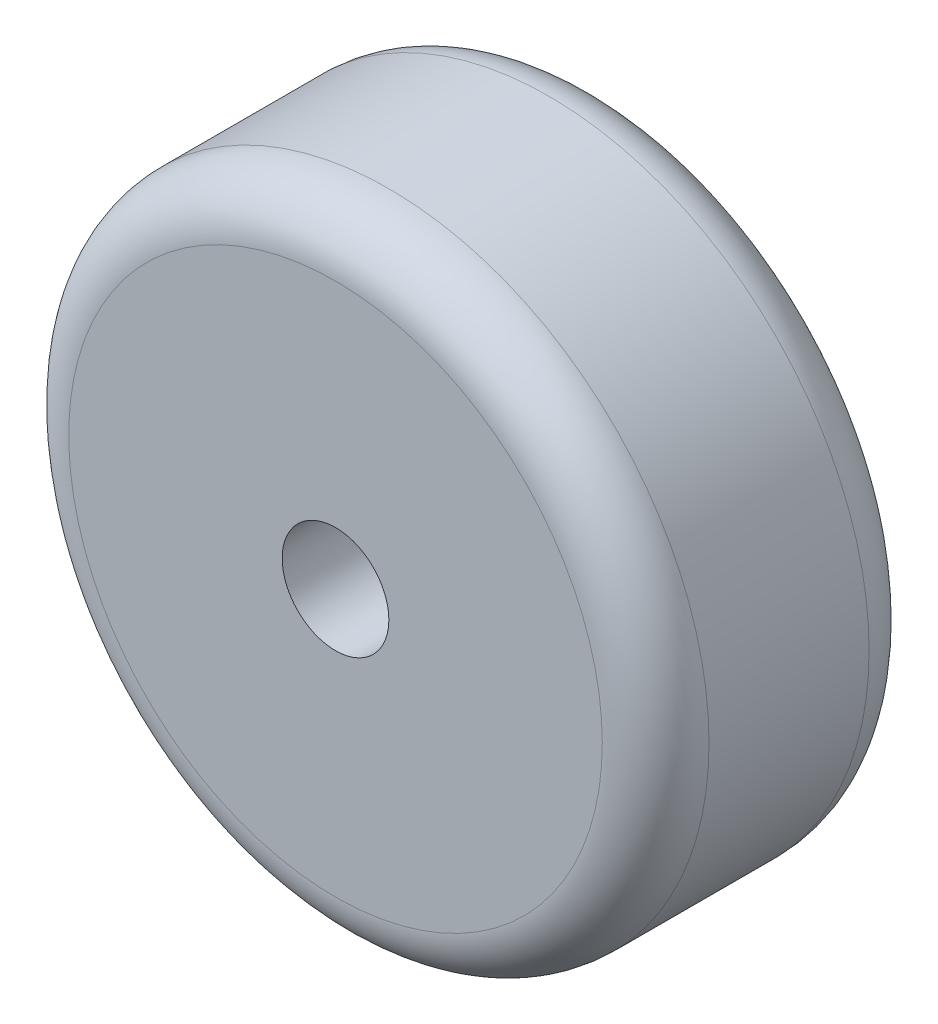
ISO-10303-21;
HEADER;
FILE_DESCRIPTION(('STEP AP214'),'2;1');
FILE_NAME('part.step','',(''),(''),'','','');
FILE_SCHEMA(('AUTOMOTIVE_DESIGN { 1 0 10303 214 1 1 1 1 }'));
ENDSEC;
DATA;
#1=APPLICATION_CONTEXT('core data for automotive mechanical design processes');
#2=APPLICATION_PROTOCOL_DEFINITION('international standard','automotive_design',2000,#1);
#3=PRODUCT_CONTEXT('',#1,'mechanical');
#4=PRODUCT('Part','Part','',(#3));
#5=PRODUCT_RELATED_PRODUCT_CATEGORY('part','',(#4));
#6=PRODUCT_DEFINITION_FORMATION('','',#4);
#7=PRODUCT_DEFINITION_CONTEXT('part definition',#1,'design');
#8=PRODUCT_DEFINITION('design','',#6,#7);
#9=PRODUCT_DEFINITION_SHAPE('','',#8);
#10=(LENGTH_UNIT() NAMED_UNIT(*) SI_UNIT(.MILLI.,.METRE.));
#11=(NAMED_UNIT(*) PLANE_ANGLE_UNIT() SI_UNIT($,.RADIAN.));
#12=(NAMED_UNIT(*) SI_UNIT($,.STERADIAN.) SOLID_ANGLE_UNIT());
#13=UNCERTAINTY_MEASURE_WITH_UNIT(LENGTH_MEASURE(1.E-05),#10,'distance_accuracy_value','');
#14=(GEOMETRIC_REPRESENTATION_CONTEXT(3) GLOBAL_UNCERTAINTY_ASSIGNED_CONTEXT((#13)) GLOBAL_UNIT_ASSIGNED_CONTEXT((#10,
#11,#12)) REPRESENTATION_CONTEXT('',''));
#15=CARTESIAN_POINT('',(0.,0.,0.));
#16=DIRECTION('',(0.,0.,1.));
#17=DIRECTION('',(1.,0.,0.));
#18=AXIS2_PLACEMENT_3D('',#15,#16,#17);
#19=CARTESIAN_POINT('',(0.,491.000207075113,5.));
#20=DIRECTION('',(0.,0.,1.));
#21=DIRECTION('',(1.,0.,0.));
#22=AXIS2_PLACEMENT_3D('',#19,#20,#21);
#23=PLANE('',#22);
#24=CARTESIAN_POINT('',(0.,491.000207075113,5.));
#25=DIRECTION('',(0.,0.,1.));
#26=DIRECTION('',(1.,0.,0.));
#27=AXIS2_PLACEMENT_3D('',#24,#25,#26);
#28=CIRCLE('',#27,5.00000000000002);
#29=CARTESIAN_POINT('',(5.00000000000002,491.000207075113,5.));
#30=VERTEX_POINT('',#29);
#31=EDGE_CURVE('E10',#30,#30,#28,.T.);
#32=ORIENTED_EDGE('',*,*,#31,.T.);
#33=EDGE_LOOP('',(#32));
#34=FACE_BOUND('',#33,.T.);
#35=CARTESIAN_POINT('',(0.,491.000207075113,5.));
#36=DIRECTION('',(0.,0.,1.));
#37=DIRECTION('',(1.,0.,0.));
#38=AXIS2_PLACEMENT_3D('',#35,#36,#37);
#39=CIRCLE('',#38,1.00000000000002);
#40=CARTESIAN_POINT('',(1.00000000000002,491.000207075113,5.));
#41=VERTEX_POINT('',#40);
#42=EDGE_CURVE('E53',#41,#41,#39,.T.);
#43=ORIENTED_EDGE('',*,*,#42,.F.);
#44=EDGE_LOOP('',(#43));
#45=FACE_BOUND('',#44,.T.);
#46=ADVANCED_FACE('F33',(#34,#45),#23,.T.);
#47=CARTESIAN_POINT('',(0.,491.000207075113,0.));
#48=DIRECTION('',(0.,0.,1.));
#49=DIRECTION('',(1.,0.,0.));
#50=AXIS2_PLACEMENT_3D('',#47,#48,#49);
#51=PLANE('',#50);
#52=CARTESIAN_POINT('',(0.,491.000207075113,0.));
#53=DIRECTION('',(0.,0.,1.));
#54=DIRECTION('',(1.,0.,0.));
#55=AXIS2_PLACEMENT_3D('',#52,#53,#54);
#56=CIRCLE('',#55,5.00000000000002);
#57=CARTESIAN_POINT('',(5.00000000000002,491.000207075113,0.));
#58=VERTEX_POINT('',#57);
#59=EDGE_CURVE('E40',#58,#58,#56,.F.);
#60=ORIENTED_EDGE('',*,*,#59,.T.);
#61=EDGE_LOOP('',(#60));
#62=FACE_BOUND('',#61,.T.);
#63=CARTESIAN_POINT('',(0.,491.000207075113,0.));
#64=DIRECTION('',(0.,0.,1.));
#65=DIRECTION('',(1.,0.,0.));
#66=AXIS2_PLACEMENT_3D('',#63,#64,#65);
#67=CIRCLE('',#66,1.00000000000002);
#68=CARTESIAN_POINT('',(1.00000000000002,491.000207075113,0.));
#69=VERTEX_POINT('',#68);
#70=EDGE_CURVE('E54',#69,#69,#67,.T.);
#71=ORIENTED_EDGE('',*,*,#70,.T.);
#72=EDGE_LOOP('',(#71));
#73=FACE_BOUND('',#72,.T.);
#74=ADVANCED_FACE('F64',(#62,#73),#51,.F.);
#75=CARTESIAN_POINT('',(0.,491.000207075113,5.));
#76=DIRECTION('',(0.,0.,-1.));
#77=DIRECTION('',(-1.,0.,0.));
#78=AXIS2_PLACEMENT_3D('',#75,#76,#77);
#79=CYLINDRICAL_SURFACE('',#78,6.00000000000002);
#80=CARTESIAN_POINT('',(0.,491.000207075113,1.));
#81=DIRECTION('',(0.,0.,1.));
#82=DIRECTION('',(1.,0.,0.));
#83=AXIS2_PLACEMENT_3D('',#80,#81,#82);
#84=CIRCLE('',#83,6.00000000000002);
#85=CARTESIAN_POINT('',(6.00000000000002,491.000207075113,1.));
#86=VERTEX_POINT('',#85);
#87=EDGE_CURVE('E44',#86,#86,#84,.T.);
#88=ORIENTED_EDGE('',*,*,#87,.T.);
#89=EDGE_LOOP('',(#88));
#90=FACE_BOUND('',#89,.T.);
#91=CARTESIAN_POINT('',(0.,491.000207075113,4.));
#92=DIRECTION('',(0.,0.,1.));
#93=DIRECTION('',(1.,0.,0.));
#94=AXIS2_PLACEMENT_3D('',#91,#92,#93);
#95=CIRCLE('',#94,6.00000000000002);
#96=CARTESIAN_POINT('',(6.00000000000002,491.000207075113,4.));
#97=VERTEX_POINT('',#96);
#98=EDGE_CURVE('E48',#97,#97,#95,.F.);
#99=ORIENTED_EDGE('',*,*,#98,.T.);
#100=EDGE_LOOP('',(#99));
#101=FACE_BOUND('',#100,.T.);
#102=ADVANCED_FACE('F69',(#90,#101),#79,.T.);
#103=CARTESIAN_POINT('',(0.,491.000207075113,5.));
#104=DIRECTION('',(0.,0.,-1.));
#105=DIRECTION('',(-1.,0.,0.));
#106=AXIS2_PLACEMENT_3D('',#103,#104,#105);
#107=CYLINDRICAL_SURFACE('',#106,1.00000000000002);
#108=ORIENTED_EDGE('',*,*,#42,.T.);
#109=EDGE_LOOP('',(#108));
#110=FACE_BOUND('',#109,.T.);
#111=ORIENTED_EDGE('',*,*,#70,.F.);
#112=EDGE_LOOP('',(#111));
#113=FACE_BOUND('',#112,.T.);
#114=ADVANCED_FACE('F60',(#110,#113),#107,.F.);
#115=CARTESIAN_POINT('',(0.,491.000207075113,1.));
#116=DIRECTION('',(0.,0.,1.));
#117=DIRECTION('',(1.,0.,0.));
#118=AXIS2_PLACEMENT_3D('',#115,#116,#117);
#119=TOROIDAL_SURFACE('',#118,5.00000000000002,1.);
#120=ORIENTED_EDGE('',*,*,#59,.F.);
#121=EDGE_LOOP('',(#120));
#122=FACE_BOUND('',#121,.T.);
#123=ORIENTED_EDGE('',*,*,#87,.F.);
#124=EDGE_LOOP('',(#123));
#125=FACE_BOUND('',#124,.T.);
#126=ADVANCED_FACE('F75',(#122,#125),#119,.T.);
#127=CARTESIAN_POINT('',(0.,491.000207075113,4.));
#128=DIRECTION('',(0.,0.,1.));
#129=DIRECTION('',(1.,0.,0.));
#130=AXIS2_PLACEMENT_3D('',#127,#128,#129);
#131=TOROIDAL_SURFACE('',#130,5.00000000000002,1.);
#132=ORIENTED_EDGE('',*,*,#98,.F.);
#133=EDGE_LOOP('',(#132));
#134=FACE_BOUND('',#133,.T.);
#135=ORIENTED_EDGE('',*,*,#31,.F.);
#136=EDGE_LOOP('',(#135));
#137=FACE_BOUND('',#136,.T.);
#138=ADVANCED_FACE('F35',(#134,#137),#131,.T.);
#139=CLOSED_SHELL('',(#46,#74,#102,#114,#126,#138));
#140=MANIFOLD_SOLID_BREP('B2',#139);
#141=ADVANCED_BREP_SHAPE_REPRESENTATION('',(#18,#140),#14);
#142=SHAPE_DEFINITION_REPRESENTATION(#9,#141);
ENDSEC;
END-ISO-10303-21;
